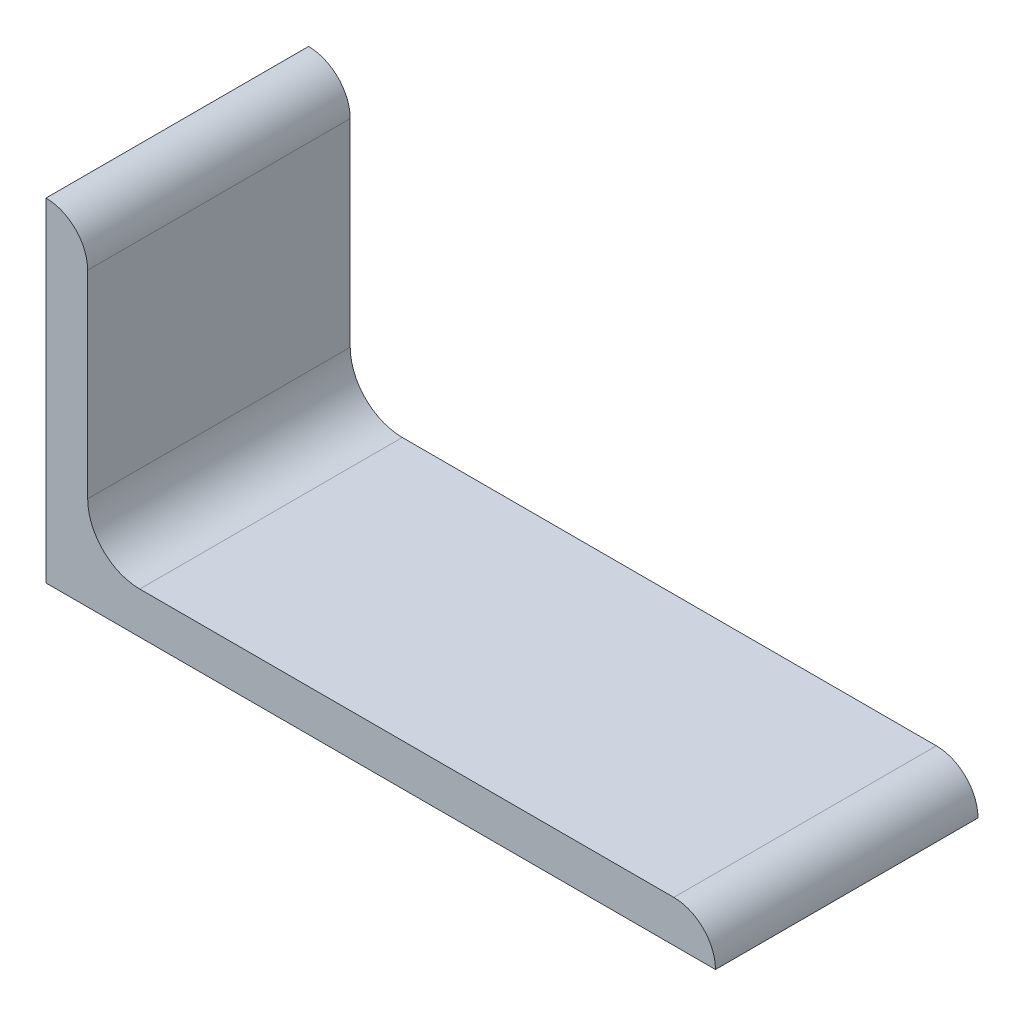
ISO-10303-21;
HEADER;
FILE_DESCRIPTION(('STEP AP214'),'2;1');
FILE_NAME('part.step','',(''),(''),'','','');
FILE_SCHEMA(('AUTOMOTIVE_DESIGN { 1 0 10303 214 1 1 1 1 }'));
ENDSEC;
DATA;
#1=APPLICATION_CONTEXT('core data for automotive mechanical design processes');
#2=APPLICATION_PROTOCOL_DEFINITION('international standard','automotive_design',2000,#1);
#3=PRODUCT_CONTEXT('',#1,'mechanical');
#4=PRODUCT('Part','Part','',(#3));
#5=PRODUCT_RELATED_PRODUCT_CATEGORY('part','',(#4));
#6=PRODUCT_DEFINITION_FORMATION('','',#4);
#7=PRODUCT_DEFINITION_CONTEXT('part definition',#1,'design');
#8=PRODUCT_DEFINITION('design','',#6,#7);
#9=PRODUCT_DEFINITION_SHAPE('','',#8);
#10=(LENGTH_UNIT() NAMED_UNIT(*) SI_UNIT(.MILLI.,.METRE.));
#11=(NAMED_UNIT(*) PLANE_ANGLE_UNIT() SI_UNIT($,.RADIAN.));
#12=(NAMED_UNIT(*) SI_UNIT($,.STERADIAN.) SOLID_ANGLE_UNIT());
#13=UNCERTAINTY_MEASURE_WITH_UNIT(LENGTH_MEASURE(1.E-05),#10,'distance_accuracy_value','');
#14=(GEOMETRIC_REPRESENTATION_CONTEXT(3) GLOBAL_UNCERTAINTY_ASSIGNED_CONTEXT((#13)) GLOBAL_UNIT_ASSIGNED_CONTEXT((#10,
#11,#12)) REPRESENTATION_CONTEXT('',''));
#15=CARTESIAN_POINT('',(0.,0.,0.));
#16=DIRECTION('',(0.,0.,1.));
#17=DIRECTION('',(1.,0.,0.));
#18=AXIS2_PLACEMENT_3D('',#15,#16,#17);
#19=CARTESIAN_POINT('',(0.,50.8,-40.));
#20=DIRECTION('',(1.,0.,0.));
#21=DIRECTION('',(0.,0.,-1.));
#22=AXIS2_PLACEMENT_3D('',#19,#20,#21);
#23=PLANE('',#22);
#24=DIRECTION('',(0.,1.,0.));
#25=VECTOR('',#24,1.);
#26=CARTESIAN_POINT('',(0.,50.8,0.));
#27=LINE('',#26,#25);
#28=CARTESIAN_POINT('',(0.,0.,0.));
#29=VERTEX_POINT('',#28);
#30=CARTESIAN_POINT('',(0.,50.8,0.));
#31=VERTEX_POINT('',#30);
#32=EDGE_CURVE('E168',#29,#31,#27,.T.);
#33=ORIENTED_EDGE('',*,*,#32,.T.);
#34=DIRECTION('',(0.,0.,1.));
#35=VECTOR('',#34,1.);
#36=CARTESIAN_POINT('',(0.,50.8,-40.));
#37=LINE('',#36,#35);
#38=CARTESIAN_POINT('',(0.,50.8,-40.));
#39=VERTEX_POINT('',#38);
#40=EDGE_CURVE('E13',#39,#31,#37,.T.);
#41=ORIENTED_EDGE('',*,*,#40,.F.);
#42=DIRECTION('',(0.,1.,0.));
#43=VECTOR('',#42,1.);
#44=CARTESIAN_POINT('',(0.,50.8,-40.));
#45=LINE('',#44,#43);
#46=CARTESIAN_POINT('',(0.,0.,-40.));
#47=VERTEX_POINT('',#46);
#48=EDGE_CURVE('E184',#47,#39,#45,.T.);
#49=ORIENTED_EDGE('',*,*,#48,.F.);
#50=DIRECTION('',(0.,0.,1.));
#51=VECTOR('',#50,1.);
#52=CARTESIAN_POINT('',(0.,0.,-40.));
#53=LINE('',#52,#51);
#54=EDGE_CURVE('E164',#47,#29,#53,.T.);
#55=ORIENTED_EDGE('',*,*,#54,.T.);
#56=EDGE_LOOP('',(#33,#41,#49,#55));
#57=FACE_BOUND('',#56,.T.);
#58=ADVANCED_FACE('F66',(#57),#23,.F.);
#59=CARTESIAN_POINT('',(0.00508,50.8,-40.));
#60=DIRECTION('',(0.,-1.,0.));
#61=DIRECTION('',(0.,0.,-1.));
#62=AXIS2_PLACEMENT_3D('',#59,#60,#61);
#63=PLANE('',#62);
#64=DIRECTION('',(1.,0.,0.));
#65=VECTOR('',#64,1.);
#66=CARTESIAN_POINT('',(0.00508,50.8,0.));
#67=LINE('',#66,#65);
#68=CARTESIAN_POINT('',(0.00508000000000024,50.8,0.));
#69=VERTEX_POINT('',#68);
#70=EDGE_CURVE('E171',#31,#69,#67,.T.);
#71=ORIENTED_EDGE('',*,*,#70,.T.);
#72=DIRECTION('',(0.,0.,1.));
#73=VECTOR('',#72,1.);
#74=CARTESIAN_POINT('',(0.00508000000000024,50.8,-40.));
#75=LINE('',#74,#73);
#76=CARTESIAN_POINT('',(0.00508000000000024,50.8,-40.));
#77=VERTEX_POINT('',#76);
#78=EDGE_CURVE('E74',#77,#69,#75,.T.);
#79=ORIENTED_EDGE('',*,*,#78,.F.);
#80=DIRECTION('',(1.,0.,0.));
#81=VECTOR('',#80,1.);
#82=CARTESIAN_POINT('',(0.00508,50.8,-40.));
#83=LINE('',#82,#81);
#84=EDGE_CURVE('E128',#39,#77,#83,.T.);
#85=ORIENTED_EDGE('',*,*,#84,.F.);
#86=ORIENTED_EDGE('',*,*,#40,.T.);
#87=EDGE_LOOP('',(#71,#79,#85,#86));
#88=FACE_BOUND('',#87,.T.);
#89=ADVANCED_FACE('F227',(#88),#63,.F.);
#90=CARTESIAN_POINT('',(0.00507999999999922,44.45508,-40.));
#91=DIRECTION('',(0.,0.,1.));
#92=DIRECTION('',(1.,0.,0.));
#93=AXIS2_PLACEMENT_3D('',#90,#91,#92);
#94=CYLINDRICAL_SURFACE('',#93,6.34492);
#95=CARTESIAN_POINT('',(0.00507999999999922,44.45508,0.));
#96=DIRECTION('',(0.,0.,-1.));
#97=DIRECTION('',(-1.,0.,0.));
#98=AXIS2_PLACEMENT_3D('',#95,#96,#97);
#99=CIRCLE('',#98,6.34492);
#100=CARTESIAN_POINT('',(6.34999999999999,44.45508,0.));
#101=VERTEX_POINT('',#100);
#102=EDGE_CURVE('E173',#69,#101,#99,.T.);
#103=ORIENTED_EDGE('',*,*,#102,.T.);
#104=DIRECTION('',(0.,0.,1.));
#105=VECTOR('',#104,1.);
#106=CARTESIAN_POINT('',(6.34999999999999,44.45508,-40.));
#107=LINE('',#106,#105);
#108=CARTESIAN_POINT('',(6.34999999999999,44.45508,-40.));
#109=VERTEX_POINT('',#108);
#110=EDGE_CURVE('E194',#109,#101,#107,.T.);
#111=ORIENTED_EDGE('',*,*,#110,.F.);
#112=CARTESIAN_POINT('',(0.00507999999999922,44.45508,-40.));
#113=DIRECTION('',(0.,0.,-1.));
#114=DIRECTION('',(-1.,0.,0.));
#115=AXIS2_PLACEMENT_3D('',#112,#113,#114);
#116=CIRCLE('',#115,6.34492);
#117=EDGE_CURVE('E202',#77,#109,#116,.T.);
#118=ORIENTED_EDGE('',*,*,#117,.F.);
#119=ORIENTED_EDGE('',*,*,#78,.T.);
#120=EDGE_LOOP('',(#103,#111,#118,#119));
#121=FACE_BOUND('',#120,.T.);
#122=ADVANCED_FACE('F200',(#121),#94,.T.);
#123=CARTESIAN_POINT('',(6.34999999999999,14.2875,-40.));
#124=DIRECTION('',(-1.,0.,0.));
#125=DIRECTION('',(0.,0.,1.));
#126=AXIS2_PLACEMENT_3D('',#123,#124,#125);
#127=PLANE('',#126);
#128=DIRECTION('',(0.,-1.,0.));
#129=VECTOR('',#128,1.);
#130=CARTESIAN_POINT('',(6.34999999999999,14.2875,0.));
#131=LINE('',#130,#129);
#132=CARTESIAN_POINT('',(6.34999999999999,14.2875,0.));
#133=VERTEX_POINT('',#132);
#134=EDGE_CURVE('E175',#101,#133,#131,.T.);
#135=ORIENTED_EDGE('',*,*,#134,.T.);
#136=DIRECTION('',(0.,0.,1.));
#137=VECTOR('',#136,1.);
#138=CARTESIAN_POINT('',(6.34999999999999,14.2875,-40.));
#139=LINE('',#138,#137);
#140=CARTESIAN_POINT('',(6.34999999999999,14.2875,-40.));
#141=VERTEX_POINT('',#140);
#142=EDGE_CURVE('E191',#141,#133,#139,.T.);
#143=ORIENTED_EDGE('',*,*,#142,.F.);
#144=DIRECTION('',(0.,-1.,0.));
#145=VECTOR('',#144,1.);
#146=CARTESIAN_POINT('',(6.34999999999999,14.2875,-40.));
#147=LINE('',#146,#145);
#148=EDGE_CURVE('E218',#109,#141,#147,.T.);
#149=ORIENTED_EDGE('',*,*,#148,.F.);
#150=ORIENTED_EDGE('',*,*,#110,.T.);
#151=EDGE_LOOP('',(#135,#143,#149,#150));
#152=FACE_BOUND('',#151,.T.);
#153=ADVANCED_FACE('F211',(#152),#127,.F.);
#154=CARTESIAN_POINT('',(14.2875,14.2875,-40.));
#155=DIRECTION('',(0.,0.,1.));
#156=DIRECTION('',(1.,0.,0.));
#157=AXIS2_PLACEMENT_3D('',#154,#155,#156);
#158=CYLINDRICAL_SURFACE('',#157,7.9375);
#159=CARTESIAN_POINT('',(14.2875,14.2875,0.));
#160=DIRECTION('',(0.,0.,1.));
#161=DIRECTION('',(1.,0.,0.));
#162=AXIS2_PLACEMENT_3D('',#159,#160,#161);
#163=CIRCLE('',#162,7.9375);
#164=CARTESIAN_POINT('',(14.2875,6.35,0.));
#165=VERTEX_POINT('',#164);
#166=EDGE_CURVE('E177',#133,#165,#163,.T.);
#167=ORIENTED_EDGE('',*,*,#166,.T.);
#168=DIRECTION('',(0.,0.,1.));
#169=VECTOR('',#168,1.);
#170=CARTESIAN_POINT('',(14.2875,6.35,-40.));
#171=LINE('',#170,#169);
#172=CARTESIAN_POINT('',(14.2875,6.35,-40.));
#173=VERTEX_POINT('',#172);
#174=EDGE_CURVE('E188',#173,#165,#171,.T.);
#175=ORIENTED_EDGE('',*,*,#174,.F.);
#176=CARTESIAN_POINT('',(14.2875,14.2875,-40.));
#177=DIRECTION('',(0.,0.,1.));
#178=DIRECTION('',(1.,0.,0.));
#179=AXIS2_PLACEMENT_3D('',#176,#177,#178);
#180=CIRCLE('',#179,7.9375);
#181=EDGE_CURVE('E217',#141,#173,#180,.T.);
#182=ORIENTED_EDGE('',*,*,#181,.F.);
#183=ORIENTED_EDGE('',*,*,#142,.T.);
#184=EDGE_LOOP('',(#167,#175,#182,#183));
#185=FACE_BOUND('',#184,.T.);
#186=ADVANCED_FACE('F215',(#185),#158,.F.);
#187=CARTESIAN_POINT('',(95.65508,6.35,-40.));
#188=DIRECTION('',(0.,-1.,0.));
#189=DIRECTION('',(1.,0.,0.));
#190=AXIS2_PLACEMENT_3D('',#187,#188,#189);
#191=PLANE('',#190);
#192=DIRECTION('',(1.,0.,0.));
#193=VECTOR('',#192,1.);
#194=CARTESIAN_POINT('',(95.65508,6.35,0.));
#195=LINE('',#194,#193);
#196=CARTESIAN_POINT('',(95.65508,6.35,0.));
#197=VERTEX_POINT('',#196);
#198=EDGE_CURVE('E179',#165,#197,#195,.T.);
#199=ORIENTED_EDGE('',*,*,#198,.T.);
#200=DIRECTION('',(0.,0.,1.));
#201=VECTOR('',#200,1.);
#202=CARTESIAN_POINT('',(95.65508,6.35,-40.));
#203=LINE('',#202,#201);
#204=CARTESIAN_POINT('',(95.65508,6.35,-40.));
#205=VERTEX_POINT('',#204);
#206=EDGE_CURVE('E159',#205,#197,#203,.T.);
#207=ORIENTED_EDGE('',*,*,#206,.F.);
#208=DIRECTION('',(1.,0.,0.));
#209=VECTOR('',#208,1.);
#210=CARTESIAN_POINT('',(95.65508,6.35,-40.));
#211=LINE('',#210,#209);
#212=EDGE_CURVE('E150',#173,#205,#211,.T.);
#213=ORIENTED_EDGE('',*,*,#212,.F.);
#214=ORIENTED_EDGE('',*,*,#174,.T.);
#215=EDGE_LOOP('',(#199,#207,#213,#214));
#216=FACE_BOUND('',#215,.T.);
#217=ADVANCED_FACE('F239',(#216),#191,.F.);
#218=CARTESIAN_POINT('',(95.65508,0.00508000000000039,-40.));
#219=DIRECTION('',(0.,0.,1.));
#220=DIRECTION('',(1.,0.,0.));
#221=AXIS2_PLACEMENT_3D('',#218,#219,#220);
#222=CYLINDRICAL_SURFACE('',#221,6.34492);
#223=CARTESIAN_POINT('',(95.65508,0.00508000000000039,0.));
#224=DIRECTION('',(0.,0.,-1.));
#225=DIRECTION('',(1.,0.,0.));
#226=AXIS2_PLACEMENT_3D('',#223,#224,#225);
#227=CIRCLE('',#226,6.34492);
#228=CARTESIAN_POINT('',(102.,0.00508,0.));
#229=VERTEX_POINT('',#228);
#230=EDGE_CURVE('E158',#197,#229,#227,.T.);
#231=ORIENTED_EDGE('',*,*,#230,.T.);
#232=DIRECTION('',(0.,0.,1.));
#233=VECTOR('',#232,1.);
#234=CARTESIAN_POINT('',(102.,0.00508,-40.));
#235=LINE('',#234,#233);
#236=CARTESIAN_POINT('',(102.,0.00508,-40.));
#237=VERTEX_POINT('',#236);
#238=EDGE_CURVE('E155',#237,#229,#235,.T.);
#239=ORIENTED_EDGE('',*,*,#238,.F.);
#240=CARTESIAN_POINT('',(95.65508,0.00508000000000039,-40.));
#241=DIRECTION('',(0.,0.,-1.));
#242=DIRECTION('',(1.,0.,0.));
#243=AXIS2_PLACEMENT_3D('',#240,#241,#242);
#244=CIRCLE('',#243,6.34492);
#245=EDGE_CURVE('E144',#205,#237,#244,.T.);
#246=ORIENTED_EDGE('',*,*,#245,.F.);
#247=ORIENTED_EDGE('',*,*,#206,.T.);
#248=EDGE_LOOP('',(#231,#239,#246,#247));
#249=FACE_BOUND('',#248,.T.);
#250=ADVANCED_FACE('F156',(#249),#222,.T.);
#251=CARTESIAN_POINT('',(102.,0.,-40.));
#252=DIRECTION('',(-1.,0.,0.));
#253=DIRECTION('',(0.,0.,1.));
#254=AXIS2_PLACEMENT_3D('',#251,#252,#253);
#255=PLANE('',#254);
#256=DIRECTION('',(0.,-1.,0.));
#257=VECTOR('',#256,1.);
#258=CARTESIAN_POINT('',(102.,0.,0.));
#259=LINE('',#258,#257);
#260=CARTESIAN_POINT('',(102.,0.,0.));
#261=VERTEX_POINT('',#260);
#262=EDGE_CURVE('E114',#229,#261,#259,.T.);
#263=ORIENTED_EDGE('',*,*,#262,.T.);
#264=DIRECTION('',(0.,0.,1.));
#265=VECTOR('',#264,1.);
#266=CARTESIAN_POINT('',(102.,0.,-40.));
#267=LINE('',#266,#265);
#268=CARTESIAN_POINT('',(102.,0.,-40.));
#269=VERTEX_POINT('',#268);
#270=EDGE_CURVE('E160',#269,#261,#267,.T.);
#271=ORIENTED_EDGE('',*,*,#270,.F.);
#272=DIRECTION('',(0.,-1.,0.));
#273=VECTOR('',#272,1.);
#274=CARTESIAN_POINT('',(102.,0.,-40.));
#275=LINE('',#274,#273);
#276=EDGE_CURVE('E148',#237,#269,#275,.T.);
#277=ORIENTED_EDGE('',*,*,#276,.F.);
#278=ORIENTED_EDGE('',*,*,#238,.T.);
#279=EDGE_LOOP('',(#263,#271,#277,#278));
#280=FACE_BOUND('',#279,.T.);
#281=ADVANCED_FACE('F162',(#280),#255,.F.);
#282=CARTESIAN_POINT('',(0.,0.,-40.));
#283=DIRECTION('',(0.,1.,0.));
#284=DIRECTION('',(0.,0.,1.));
#285=AXIS2_PLACEMENT_3D('',#282,#283,#284);
#286=PLANE('',#285);
#287=DIRECTION('',(-1.,0.,0.));
#288=VECTOR('',#287,1.);
#289=CARTESIAN_POINT('',(0.,0.,0.));
#290=LINE('',#289,#288);
#291=EDGE_CURVE('E120',#261,#29,#290,.T.);
#292=ORIENTED_EDGE('',*,*,#291,.T.);
#293=ORIENTED_EDGE('',*,*,#54,.F.);
#294=DIRECTION('',(-1.,0.,0.));
#295=VECTOR('',#294,1.);
#296=CARTESIAN_POINT('',(0.,0.,-40.));
#297=LINE('',#296,#295);
#298=EDGE_CURVE('E82',#269,#47,#297,.T.);
#299=ORIENTED_EDGE('',*,*,#298,.F.);
#300=ORIENTED_EDGE('',*,*,#270,.T.);
#301=EDGE_LOOP('',(#292,#293,#299,#300));
#302=FACE_BOUND('',#301,.T.);
#303=ADVANCED_FACE('F247',(#302),#286,.F.);
#304=CARTESIAN_POINT('',(95.65508,0.00508000000000039,-40.));
#305=DIRECTION('',(0.,0.,1.));
#306=DIRECTION('',(1.,0.,0.));
#307=AXIS2_PLACEMENT_3D('',#304,#305,#306);
#308=PLANE('',#307);
#309=ORIENTED_EDGE('',*,*,#48,.T.);
#310=ORIENTED_EDGE('',*,*,#84,.T.);
#311=ORIENTED_EDGE('',*,*,#117,.T.);
#312=ORIENTED_EDGE('',*,*,#148,.T.);
#313=ORIENTED_EDGE('',*,*,#181,.T.);
#314=ORIENTED_EDGE('',*,*,#212,.T.);
#315=ORIENTED_EDGE('',*,*,#245,.T.);
#316=ORIENTED_EDGE('',*,*,#276,.T.);
#317=ORIENTED_EDGE('',*,*,#298,.T.);
#318=EDGE_LOOP('',(#309,#310,#311,#312,#313,#314,#315,#316,#317));
#319=FACE_BOUND('',#318,.T.);
#320=ADVANCED_FACE('F146',(#319),#308,.F.);
#321=CARTESIAN_POINT('',(95.65508,0.00508000000000039,0.));
#322=DIRECTION('',(0.,0.,1.));
#323=DIRECTION('',(1.,0.,0.));
#324=AXIS2_PLACEMENT_3D('',#321,#322,#323);
#325=PLANE('',#324);
#326=ORIENTED_EDGE('',*,*,#32,.F.);
#327=ORIENTED_EDGE('',*,*,#291,.F.);
#328=ORIENTED_EDGE('',*,*,#262,.F.);
#329=ORIENTED_EDGE('',*,*,#230,.F.);
#330=ORIENTED_EDGE('',*,*,#198,.F.);
#331=ORIENTED_EDGE('',*,*,#166,.F.);
#332=ORIENTED_EDGE('',*,*,#134,.F.);
#333=ORIENTED_EDGE('',*,*,#102,.F.);
#334=ORIENTED_EDGE('',*,*,#70,.F.);
#335=EDGE_LOOP('',(#326,#327,#328,#329,#330,#331,#332,#333,#334));
#336=FACE_BOUND('',#335,.T.);
#337=ADVANCED_FACE('F206',(#336),#325,.T.);
#338=CLOSED_SHELL('',(#58,#89,#122,#153,#186,#217,#250,#281,#303,#320,#337));
#339=MANIFOLD_SOLID_BREP('B2',#338);
#340=ADVANCED_BREP_SHAPE_REPRESENTATION('',(#18,#339),#14);
#341=SHAPE_DEFINITION_REPRESENTATION(#9,#340);
ENDSEC;
END-ISO-10303-21;
